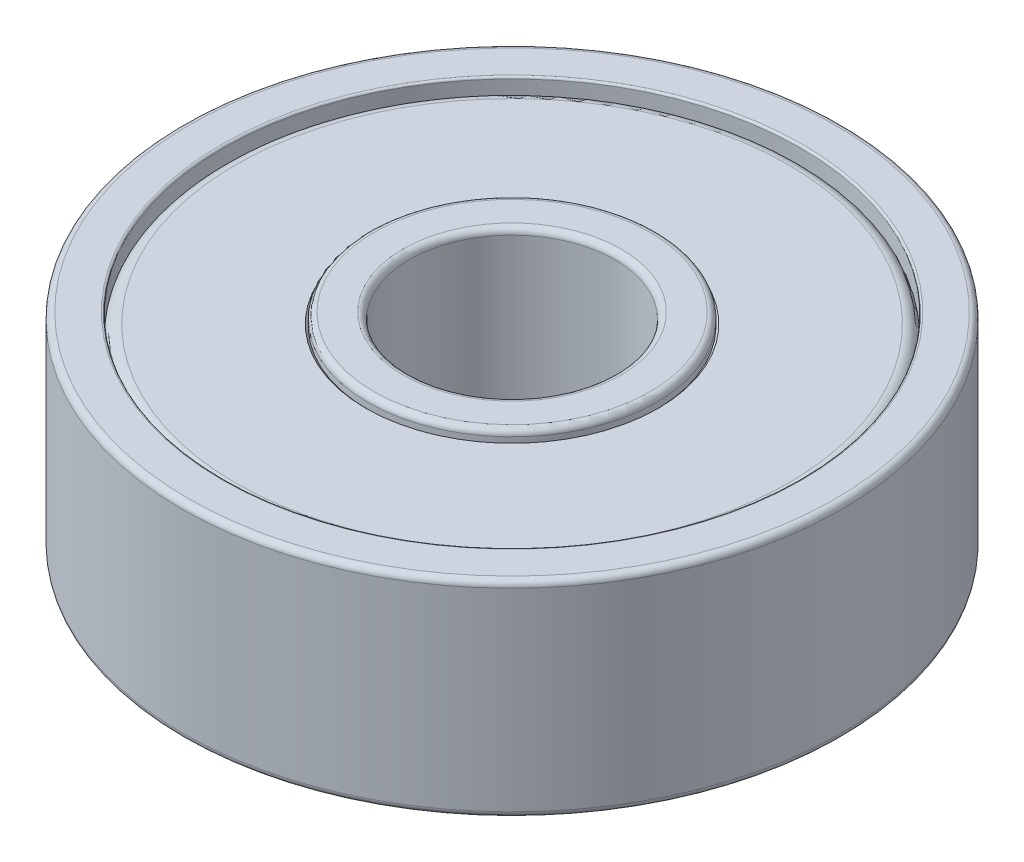
ISO-10303-21;
HEADER;
FILE_DESCRIPTION(('STEP AP214'),'2;1');
FILE_NAME('part.step','',(''),(''),'','','');
FILE_SCHEMA(('AUTOMOTIVE_DESIGN { 1 0 10303 214 1 1 1 1 }'));
ENDSEC;
DATA;
#1=APPLICATION_CONTEXT('core data for automotive mechanical design processes');
#2=APPLICATION_PROTOCOL_DEFINITION('international standard','automotive_design',2000,#1);
#3=PRODUCT_CONTEXT('',#1,'mechanical');
#4=PRODUCT('Part','Part','',(#3));
#5=PRODUCT_RELATED_PRODUCT_CATEGORY('part','',(#4));
#6=PRODUCT_DEFINITION_FORMATION('','',#4);
#7=PRODUCT_DEFINITION_CONTEXT('part definition',#1,'design');
#8=PRODUCT_DEFINITION('design','',#6,#7);
#9=PRODUCT_DEFINITION_SHAPE('','',#8);
#10=(LENGTH_UNIT() NAMED_UNIT(*) SI_UNIT(.MILLI.,.METRE.));
#11=(NAMED_UNIT(*) PLANE_ANGLE_UNIT() SI_UNIT($,.RADIAN.));
#12=(NAMED_UNIT(*) SI_UNIT($,.STERADIAN.) SOLID_ANGLE_UNIT());
#13=UNCERTAINTY_MEASURE_WITH_UNIT(LENGTH_MEASURE(1.E-05),#10,'distance_accuracy_value','');
#14=(GEOMETRIC_REPRESENTATION_CONTEXT(3) GLOBAL_UNCERTAINTY_ASSIGNED_CONTEXT((#13)) GLOBAL_UNIT_ASSIGNED_CONTEXT((#10,
#11,#12)) REPRESENTATION_CONTEXT('',''));
#15=CARTESIAN_POINT('',(0.,0.,0.));
#16=DIRECTION('',(0.,0.,1.));
#17=DIRECTION('',(1.,0.,0.));
#18=AXIS2_PLACEMENT_3D('',#15,#16,#17);
#19=CARTESIAN_POINT('',(0.,2.25,0.));
#20=DIRECTION('',(0.,1.,0.));
#21=DIRECTION('',(0.,0.,1.));
#22=AXIS2_PLACEMENT_3D('',#19,#20,#21);
#23=PLANE('',#22);
#24=CARTESIAN_POINT('',(0.,2.25,0.));
#25=DIRECTION('',(0.,1.,0.));
#26=DIRECTION('',(0.,0.,1.));
#27=AXIS2_PLACEMENT_3D('',#24,#25,#26);
#28=CIRCLE('',#27,3.55);
#29=CARTESIAN_POINT('',(0.,2.25,3.55));
#30=VERTEX_POINT('',#29);
#31=EDGE_CURVE('E12',#30,#30,#28,.F.);
#32=ORIENTED_EDGE('',*,*,#31,.T.);
#33=EDGE_LOOP('',(#32));
#34=FACE_BOUND('',#33,.T.);
#35=CARTESIAN_POINT('',(0.,2.25,0.));
#36=DIRECTION('',(0.,1.,0.));
#37=DIRECTION('',(0.,0.,1.));
#38=AXIS2_PLACEMENT_3D('',#35,#36,#37);
#39=CIRCLE('',#38,6.7);
#40=CARTESIAN_POINT('',(0.,2.25,6.7));
#41=VERTEX_POINT('',#40);
#42=EDGE_CURVE('E72',#41,#41,#39,.T.);
#43=ORIENTED_EDGE('',*,*,#42,.T.);
#44=EDGE_LOOP('',(#43));
#45=FACE_BOUND('',#44,.T.);
#46=ADVANCED_FACE('F52',(#34,#45),#23,.T.);
#47=CARTESIAN_POINT('',(0.,-2.25,0.));
#48=DIRECTION('',(0.,1.,0.));
#49=DIRECTION('',(0.,0.,1.));
#50=AXIS2_PLACEMENT_3D('',#47,#48,#49);
#51=PLANE('',#50);
#52=CARTESIAN_POINT('',(0.,-2.25,0.));
#53=DIRECTION('',(0.,1.,0.));
#54=DIRECTION('',(0.,0.,1.));
#55=AXIS2_PLACEMENT_3D('',#52,#53,#54);
#56=CIRCLE('',#55,3.55);
#57=CARTESIAN_POINT('',(0.,-2.25,3.55));
#58=VERTEX_POINT('',#57);
#59=EDGE_CURVE('E67',#58,#58,#56,.T.);
#60=ORIENTED_EDGE('',*,*,#59,.T.);
#61=EDGE_LOOP('',(#60));
#62=FACE_BOUND('',#61,.T.);
#63=CARTESIAN_POINT('',(0.,-2.25,0.));
#64=DIRECTION('',(0.,1.,0.));
#65=DIRECTION('',(0.,0.,1.));
#66=AXIS2_PLACEMENT_3D('',#63,#64,#65);
#67=CIRCLE('',#66,6.7);
#68=CARTESIAN_POINT('',(0.,-2.25,6.7));
#69=VERTEX_POINT('',#68);
#70=EDGE_CURVE('E75',#69,#69,#67,.F.);
#71=ORIENTED_EDGE('',*,*,#70,.T.);
#72=EDGE_LOOP('',(#71));
#73=FACE_BOUND('',#72,.T.);
#74=ADVANCED_FACE('F96',(#62,#73),#51,.F.);
#75=CARTESIAN_POINT('',(0.,2.25,0.));
#76=DIRECTION('',(0.,-1.,0.));
#77=DIRECTION('',(0.,0.,-1.));
#78=AXIS2_PLACEMENT_3D('',#75,#76,#77);
#79=CYLINDRICAL_SURFACE('',#78,7.);
#80=CARTESIAN_POINT('',(0.,-1.95,0.));
#81=DIRECTION('',(0.,1.,0.));
#82=DIRECTION('',(0.,0.,1.));
#83=AXIS2_PLACEMENT_3D('',#80,#81,#82);
#84=CIRCLE('',#83,7.);
#85=CARTESIAN_POINT('',(0.,-1.95,7.));
#86=VERTEX_POINT('',#85);
#87=EDGE_CURVE('E78',#86,#86,#84,.T.);
#88=ORIENTED_EDGE('',*,*,#87,.T.);
#89=EDGE_LOOP('',(#88));
#90=FACE_BOUND('',#89,.T.);
#91=CARTESIAN_POINT('',(0.,1.95,0.));
#92=DIRECTION('',(0.,1.,0.));
#93=DIRECTION('',(0.,0.,1.));
#94=AXIS2_PLACEMENT_3D('',#91,#92,#93);
#95=CIRCLE('',#94,7.);
#96=CARTESIAN_POINT('',(0.,1.95,7.));
#97=VERTEX_POINT('',#96);
#98=EDGE_CURVE('E81',#97,#97,#95,.F.);
#99=ORIENTED_EDGE('',*,*,#98,.T.);
#100=EDGE_LOOP('',(#99));
#101=FACE_BOUND('',#100,.T.);
#102=ADVANCED_FACE('F85',(#90,#101),#79,.T.);
#103=CARTESIAN_POINT('',(0.,2.25,0.));
#104=DIRECTION('',(0.,-1.,0.));
#105=DIRECTION('',(0.,0.,-1.));
#106=AXIS2_PLACEMENT_3D('',#103,#104,#105);
#107=CYLINDRICAL_SURFACE('',#106,3.5);
#108=CARTESIAN_POINT('',(0.,-2.2,0.));
#109=DIRECTION('',(0.,1.,0.));
#110=DIRECTION('',(0.,0.,1.));
#111=AXIS2_PLACEMENT_3D('',#108,#109,#110);
#112=CIRCLE('',#111,3.5);
#113=CARTESIAN_POINT('',(0.,-2.2,3.5));
#114=VERTEX_POINT('',#113);
#115=EDGE_CURVE('E59',#114,#114,#112,.F.);
#116=ORIENTED_EDGE('',*,*,#115,.T.);
#117=EDGE_LOOP('',(#116));
#118=FACE_BOUND('',#117,.T.);
#119=CARTESIAN_POINT('',(0.,2.2,0.));
#120=DIRECTION('',(0.,1.,0.));
#121=DIRECTION('',(0.,0.,1.));
#122=AXIS2_PLACEMENT_3D('',#119,#120,#121);
#123=CIRCLE('',#122,3.5);
#124=CARTESIAN_POINT('',(0.,2.2,3.5));
#125=VERTEX_POINT('',#124);
#126=EDGE_CURVE('E63',#125,#125,#123,.T.);
#127=ORIENTED_EDGE('',*,*,#126,.T.);
#128=EDGE_LOOP('',(#127));
#129=FACE_BOUND('',#128,.T.);
#130=ADVANCED_FACE('F104',(#118,#129),#107,.F.);
#131=CARTESIAN_POINT('',(0.,-1.95,0.));
#132=DIRECTION('',(0.,1.,0.));
#133=DIRECTION('',(0.,0.,1.));
#134=AXIS2_PLACEMENT_3D('',#131,#132,#133);
#135=TOROIDAL_SURFACE('',#134,6.7,0.3);
#136=ORIENTED_EDGE('',*,*,#70,.F.);
#137=EDGE_LOOP('',(#136));
#138=FACE_BOUND('',#137,.T.);
#139=ORIENTED_EDGE('',*,*,#87,.F.);
#140=EDGE_LOOP('',(#139));
#141=FACE_BOUND('',#140,.T.);
#142=ADVANCED_FACE('F91',(#138,#141),#135,.T.);
#143=CARTESIAN_POINT('',(0.,1.95,0.));
#144=DIRECTION('',(0.,1.,0.));
#145=DIRECTION('',(0.,0.,1.));
#146=AXIS2_PLACEMENT_3D('',#143,#144,#145);
#147=TOROIDAL_SURFACE('',#146,6.7,0.3);
#148=ORIENTED_EDGE('',*,*,#98,.F.);
#149=EDGE_LOOP('',(#148));
#150=FACE_BOUND('',#149,.T.);
#151=ORIENTED_EDGE('',*,*,#42,.F.);
#152=EDGE_LOOP('',(#151));
#153=FACE_BOUND('',#152,.T.);
#154=ADVANCED_FACE('F87',(#150,#153),#147,.T.);
#155=CARTESIAN_POINT('',(0.,-2.25,0.));
#156=DIRECTION('',(0.,-1.,0.));
#157=DIRECTION('',(0.,0.,-1.));
#158=AXIS2_PLACEMENT_3D('',#155,#156,#157);
#159=CONICAL_SURFACE('',#158,3.55,0.785398163397453);
#160=ORIENTED_EDGE('',*,*,#115,.F.);
#161=EDGE_LOOP('',(#160));
#162=FACE_BOUND('',#161,.T.);
#163=ORIENTED_EDGE('',*,*,#59,.F.);
#164=EDGE_LOOP('',(#163));
#165=FACE_BOUND('',#164,.T.);
#166=ADVANCED_FACE('F90',(#162,#165),#159,.F.);
#167=CARTESIAN_POINT('',(0.,2.2,0.));
#168=DIRECTION('',(0.,1.,0.));
#169=DIRECTION('',(0.,0.,1.));
#170=AXIS2_PLACEMENT_3D('',#167,#168,#169);
#171=CONICAL_SURFACE('',#170,3.5,0.785398163397483);
#172=CARTESIAN_POINT('',(0.,2.25,3.55));
#173=CARTESIAN_POINT('',(0.,2.24947916666667,3.54947916666667));
#174=CARTESIAN_POINT('',(0.,2.24895833333333,3.54895833333333));
#175=CARTESIAN_POINT('',(0.,2.24791666666667,3.54791666666667));
#176=CARTESIAN_POINT('',(0.,2.24739583333333,3.54739583333333));
#177=CARTESIAN_POINT('',(0.,2.24635416666667,3.54635416666667));
#178=CARTESIAN_POINT('',(0.,2.24583333333333,3.54583333333333));
#179=CARTESIAN_POINT('',(0.,2.24479166666667,3.54479166666667));
#180=CARTESIAN_POINT('',(0.,2.24427083333333,3.54427083333333));
#181=CARTESIAN_POINT('',(0.,2.24322916666667,3.54322916666667));
#182=CARTESIAN_POINT('',(0.,2.24270833333333,3.54270833333333));
#183=CARTESIAN_POINT('',(0.,2.24166666666667,3.54166666666667));
#184=CARTESIAN_POINT('',(0.,2.24114583333333,3.54114583333333));
#185=CARTESIAN_POINT('',(0.,2.24010416666667,3.54010416666667));
#186=CARTESIAN_POINT('',(0.,2.23958333333333,3.53958333333333));
#187=CARTESIAN_POINT('',(0.,2.23854166666667,3.53854166666667));
#188=CARTESIAN_POINT('',(0.,2.23802083333333,3.53802083333333));
#189=CARTESIAN_POINT('',(0.,2.23697916666667,3.53697916666667));
#190=CARTESIAN_POINT('',(0.,2.23645833333333,3.53645833333333));
#191=CARTESIAN_POINT('',(0.,2.23541666666667,3.53541666666667));
#192=CARTESIAN_POINT('',(0.,2.23489583333333,3.53489583333333));
#193=CARTESIAN_POINT('',(0.,2.23385416666667,3.53385416666667));
#194=CARTESIAN_POINT('',(0.,2.23333333333333,3.53333333333333));
#195=CARTESIAN_POINT('',(0.,2.23229166666667,3.53229166666667));
#196=CARTESIAN_POINT('',(0.,2.23177083333333,3.53177083333333));
#197=CARTESIAN_POINT('',(0.,2.23072916666667,3.53072916666667));
#198=CARTESIAN_POINT('',(0.,2.23020833333333,3.53020833333333));
#199=CARTESIAN_POINT('',(0.,2.22916666666667,3.52916666666667));
#200=CARTESIAN_POINT('',(0.,2.22864583333333,3.52864583333333));
#201=CARTESIAN_POINT('',(0.,2.22760416666667,3.52760416666667));
#202=CARTESIAN_POINT('',(0.,2.22708333333333,3.52708333333333));
#203=CARTESIAN_POINT('',(0.,2.22604166666667,3.52604166666667));
#204=CARTESIAN_POINT('',(0.,2.22552083333334,3.52552083333333));
#205=CARTESIAN_POINT('',(0.,2.22447916666667,3.52447916666667));
#206=CARTESIAN_POINT('',(0.,2.22395833333334,3.52395833333333));
#207=CARTESIAN_POINT('',(0.,2.22291666666667,3.52291666666667));
#208=CARTESIAN_POINT('',(0.,2.22239583333334,3.52239583333333));
#209=CARTESIAN_POINT('',(0.,2.22135416666667,3.52135416666667));
#210=CARTESIAN_POINT('',(0.,2.22083333333334,3.52083333333333));
#211=CARTESIAN_POINT('',(0.,2.21979166666667,3.51979166666667));
#212=CARTESIAN_POINT('',(0.,2.21927083333334,3.51927083333333));
#213=CARTESIAN_POINT('',(0.,2.21822916666667,3.51822916666667));
#214=CARTESIAN_POINT('',(0.,2.21770833333334,3.51770833333333));
#215=CARTESIAN_POINT('',(0.,2.21666666666667,3.51666666666667));
#216=CARTESIAN_POINT('',(0.,2.21614583333334,3.51614583333333));
#217=CARTESIAN_POINT('',(0.,2.21510416666667,3.51510416666667));
#218=CARTESIAN_POINT('',(0.,2.21458333333334,3.51458333333333));
#219=CARTESIAN_POINT('',(0.,2.21354166666667,3.51354166666667));
#220=CARTESIAN_POINT('',(0.,2.21302083333334,3.51302083333333));
#221=CARTESIAN_POINT('',(0.,2.21197916666667,3.51197916666667));
#222=CARTESIAN_POINT('',(0.,2.21145833333334,3.51145833333333));
#223=CARTESIAN_POINT('',(0.,2.21041666666667,3.51041666666667));
#224=CARTESIAN_POINT('',(0.,2.20989583333334,3.50989583333333));
#225=CARTESIAN_POINT('',(0.,2.20885416666667,3.50885416666667));
#226=CARTESIAN_POINT('',(0.,2.20833333333334,3.50833333333333));
#227=CARTESIAN_POINT('',(0.,2.20729166666667,3.50729166666667));
#228=CARTESIAN_POINT('',(0.,2.20677083333334,3.50677083333333));
#229=CARTESIAN_POINT('',(0.,2.20572916666667,3.50572916666667));
#230=CARTESIAN_POINT('',(0.,2.20520833333334,3.50520833333333));
#231=CARTESIAN_POINT('',(0.,2.20416666666667,3.50416666666667));
#232=CARTESIAN_POINT('',(0.,2.20364583333334,3.50364583333333));
#233=CARTESIAN_POINT('',(0.,2.20260416666667,3.50260416666667));
#234=CARTESIAN_POINT('',(0.,2.20208333333334,3.50208333333333));
#235=CARTESIAN_POINT('',(0.,2.20104166666667,3.50104166666667));
#236=CARTESIAN_POINT('',(0.,2.20052083333334,3.50052083333333));
#237=CARTESIAN_POINT('',(0.,2.2,3.5));
#238=B_SPLINE_CURVE_WITH_KNOTS('',3,(#172,#173,#174,#175,#176,#177,#178,#179,#180,#181,#182,
#183,#184,#185,#186,#187,#188,#189,#190,#191,#192,#193,#194,#195,#196,#197,#198,#199,#200,#201,
#202,#203,#204,#205,#206,#207,#208,#209,#210,#211,#212,#213,#214,#215,#216,#217,#218,#219,#220,
#221,#222,#223,#224,#225,#226,#227,#228,#229,#230,#231,#232,#233,#234,#235,#236,#237),
.UNSPECIFIED.,.F.,.F.,(4,2,2,2,2,2,2,2,2,2,2,2,2,2,2,2,2,2,2,2,2,2,2,2,2,2,2,2,2,2,2,2,4),(0.,
0.00220970869120833,0.00441941738241605,0.00662912607362377,0.00883883476483179,
0.0110485434560395,0.0132582521472475,0.0154679608384553,0.017677669529663,0.019887378220871,
0.0220970869120787,0.0243067956032867,0.0265165042944948,0.0287262129857025,0.0309359216769102,
0.0331456303681182,0.0353553390593259,0.0375650477505337,0.0397747564417417,0.0419844651329494,
0.0441941738241571,0.0464038825153652,0.0486135912065732,0.0508232998977809,0.0530330085889889,
0.0552427172801966,0.0574524259714044,0.0596621346626124,0.0618718433538201,0.0640815520450278,
0.0662912607362358,0.0685009694274436,0.0707106781186516),.UNSPECIFIED.);
#239=EDGE_CURVE('BSEAM54',#30,#125,#238,.T.);
#240=ORIENTED_EDGE('',*,*,#31,.F.);
#241=ORIENTED_EDGE('',*,*,#126,.F.);
#242=ORIENTED_EDGE('',*,*,#239,.T.);
#243=ORIENTED_EDGE('',*,*,#239,.F.);
#244=EDGE_LOOP('',(#240,#242,#241,#243));
#245=FACE_BOUND('',#244,.T.);
#246=ADVANCED_FACE('F54',(#245),#171,.F.);
#247=CLOSED_SHELL('',(#46,#74,#102,#130,#142,#154,#166,#246));
#248=MANIFOLD_SOLID_BREP('B2',#247);
#249=CARTESIAN_POINT('',(0.,2.5,0.));
#250=DIRECTION('',(0.,-1.,0.));
#251=DIRECTION('',(0.,0.,-1.));
#252=AXIS2_PLACEMENT_3D('',#249,#250,#251);
#253=CYLINDRICAL_SURFACE('',#252,2.5);
#254=CARTESIAN_POINT('',(0.,-2.35,0.));
#255=DIRECTION('',(0.,1.,0.));
#256=DIRECTION('',(0.,0.,1.));
#257=AXIS2_PLACEMENT_3D('',#254,#255,#256);
#258=CIRCLE('',#257,2.5);
#259=CARTESIAN_POINT('',(0.,-2.35,2.5));
#260=VERTEX_POINT('',#259);
#261=EDGE_CURVE('E201',#260,#260,#258,.F.);
#262=ORIENTED_EDGE('',*,*,#261,.T.);
#263=EDGE_LOOP('',(#262));
#264=FACE_BOUND('',#263,.T.);
#265=CARTESIAN_POINT('',(0.,2.35,0.));
#266=DIRECTION('',(0.,1.,0.));
#267=DIRECTION('',(0.,0.,1.));
#268=AXIS2_PLACEMENT_3D('',#265,#266,#267);
#269=CIRCLE('',#268,2.5);
#270=CARTESIAN_POINT('',(0.,2.35,2.5));
#271=VERTEX_POINT('',#270);
#272=EDGE_CURVE('E204',#271,#271,#269,.T.);
#273=ORIENTED_EDGE('',*,*,#272,.T.);
#274=EDGE_LOOP('',(#273));
#275=FACE_BOUND('',#274,.T.);
#276=ADVANCED_FACE('F181',(#264,#275),#253,.F.);
#277=CARTESIAN_POINT('',(0.,2.5,0.));
#278=DIRECTION('',(0.,-1.,0.));
#279=DIRECTION('',(0.,0.,-1.));
#280=AXIS2_PLACEMENT_3D('',#277,#278,#279);
#281=CYLINDRICAL_SURFACE('',#280,3.5);
#282=CARTESIAN_POINT('',(0.,-2.35,0.));
#283=DIRECTION('',(0.,1.,0.));
#284=DIRECTION('',(0.,0.,1.));
#285=AXIS2_PLACEMENT_3D('',#282,#283,#284);
#286=CIRCLE('',#285,3.5);
#287=CARTESIAN_POINT('',(0.,-2.35,3.5));
#288=VERTEX_POINT('',#287);
#289=EDGE_CURVE('E51',#288,#288,#286,.T.);
#290=ORIENTED_EDGE('',*,*,#289,.T.);
#291=EDGE_LOOP('',(#290));
#292=FACE_BOUND('',#291,.T.);
#293=CARTESIAN_POINT('',(0.,2.35,0.));
#294=DIRECTION('',(0.,1.,0.));
#295=DIRECTION('',(0.,0.,1.));
#296=AXIS2_PLACEMENT_3D('',#293,#294,#295);
#297=CIRCLE('',#296,3.5);
#298=CARTESIAN_POINT('',(0.,2.35,3.5));
#299=VERTEX_POINT('',#298);
#300=EDGE_CURVE('E188',#299,#299,#297,.F.);
#301=ORIENTED_EDGE('',*,*,#300,.T.);
#302=EDGE_LOOP('',(#301));
#303=FACE_BOUND('',#302,.T.);
#304=ADVANCED_FACE('F229',(#292,#303),#281,.T.);
#305=CARTESIAN_POINT('',(0.,2.5,0.));
#306=DIRECTION('',(0.,1.,0.));
#307=DIRECTION('',(0.,0.,1.));
#308=AXIS2_PLACEMENT_3D('',#305,#306,#307);
#309=PLANE('',#308);
#310=CARTESIAN_POINT('',(0.,2.5,0.));
#311=DIRECTION('',(0.,1.,0.));
#312=DIRECTION('',(0.,0.,1.));
#313=AXIS2_PLACEMENT_3D('',#310,#311,#312);
#314=CIRCLE('',#313,2.65);
#315=CARTESIAN_POINT('',(0.,2.5,2.65));
#316=VERTEX_POINT('',#315);
#317=EDGE_CURVE('E192',#316,#316,#314,.F.);
#318=ORIENTED_EDGE('',*,*,#317,.T.);
#319=EDGE_LOOP('',(#318));
#320=FACE_BOUND('',#319,.T.);
#321=CARTESIAN_POINT('',(0.,2.5,0.));
#322=DIRECTION('',(0.,1.,0.));
#323=DIRECTION('',(0.,0.,1.));
#324=AXIS2_PLACEMENT_3D('',#321,#322,#323);
#325=CIRCLE('',#324,3.35);
#326=CARTESIAN_POINT('',(0.,2.5,3.35));
#327=VERTEX_POINT('',#326);
#328=EDGE_CURVE('E196',#327,#327,#325,.T.);
#329=ORIENTED_EDGE('',*,*,#328,.T.);
#330=EDGE_LOOP('',(#329));
#331=FACE_BOUND('',#330,.T.);
#332=ADVANCED_FACE('F235',(#320,#331),#309,.T.);
#333=CARTESIAN_POINT('',(0.,-2.5,0.));
#334=DIRECTION('',(0.,1.,0.));
#335=DIRECTION('',(0.,0.,1.));
#336=AXIS2_PLACEMENT_3D('',#333,#334,#335);
#337=PLANE('',#336);
#338=CARTESIAN_POINT('',(0.,-2.5,0.));
#339=DIRECTION('',(0.,1.,0.));
#340=DIRECTION('',(0.,0.,1.));
#341=AXIS2_PLACEMENT_3D('',#338,#339,#340);
#342=CIRCLE('',#341,2.65);
#343=CARTESIAN_POINT('',(0.,-2.5,2.65));
#344=VERTEX_POINT('',#343);
#345=EDGE_CURVE('E207',#344,#344,#342,.T.);
#346=ORIENTED_EDGE('',*,*,#345,.T.);
#347=EDGE_LOOP('',(#346));
#348=FACE_BOUND('',#347,.T.);
#349=CARTESIAN_POINT('',(0.,-2.5,0.));
#350=DIRECTION('',(0.,1.,0.));
#351=DIRECTION('',(0.,0.,1.));
#352=AXIS2_PLACEMENT_3D('',#349,#350,#351);
#353=CIRCLE('',#352,3.35);
#354=CARTESIAN_POINT('',(0.,-2.5,3.35));
#355=VERTEX_POINT('',#354);
#356=EDGE_CURVE('E210',#355,#355,#353,.F.);
#357=ORIENTED_EDGE('',*,*,#356,.T.);
#358=EDGE_LOOP('',(#357));
#359=FACE_BOUND('',#358,.T.);
#360=ADVANCED_FACE('F214',(#348,#359),#337,.F.);
#361=CARTESIAN_POINT('',(0.,-2.35,0.));
#362=DIRECTION('',(0.,1.,0.));
#363=DIRECTION('',(0.,0.,1.));
#364=AXIS2_PLACEMENT_3D('',#361,#362,#363);
#365=TOROIDAL_SURFACE('',#364,2.65,0.15);
#366=ORIENTED_EDGE('',*,*,#261,.F.);
#367=EDGE_LOOP('',(#366));
#368=FACE_BOUND('',#367,.T.);
#369=ORIENTED_EDGE('',*,*,#345,.F.);
#370=EDGE_LOOP('',(#369));
#371=FACE_BOUND('',#370,.T.);
#372=ADVANCED_FACE('F225',(#368,#371),#365,.T.);
#373=CARTESIAN_POINT('',(0.,2.35,0.));
#374=DIRECTION('',(0.,1.,0.));
#375=DIRECTION('',(0.,0.,1.));
#376=AXIS2_PLACEMENT_3D('',#373,#374,#375);
#377=TOROIDAL_SURFACE('',#376,2.65,0.15);
#378=ORIENTED_EDGE('',*,*,#317,.F.);
#379=EDGE_LOOP('',(#378));
#380=FACE_BOUND('',#379,.T.);
#381=ORIENTED_EDGE('',*,*,#272,.F.);
#382=EDGE_LOOP('',(#381));
#383=FACE_BOUND('',#382,.T.);
#384=ADVANCED_FACE('F219',(#380,#383),#377,.T.);
#385=CARTESIAN_POINT('',(0.,-2.35,0.));
#386=DIRECTION('',(0.,1.,0.));
#387=DIRECTION('',(0.,0.,1.));
#388=AXIS2_PLACEMENT_3D('',#385,#386,#387);
#389=TOROIDAL_SURFACE('',#388,3.35,0.15);
#390=ORIENTED_EDGE('',*,*,#356,.F.);
#391=EDGE_LOOP('',(#390));
#392=FACE_BOUND('',#391,.T.);
#393=ORIENTED_EDGE('',*,*,#289,.F.);
#394=EDGE_LOOP('',(#393));
#395=FACE_BOUND('',#394,.T.);
#396=ADVANCED_FACE('F216',(#392,#395),#389,.T.);
#397=CARTESIAN_POINT('',(0.,2.35,0.));
#398=DIRECTION('',(0.,1.,0.));
#399=DIRECTION('',(0.,0.,1.));
#400=AXIS2_PLACEMENT_3D('',#397,#398,#399);
#401=TOROIDAL_SURFACE('',#400,3.35,0.15);
#402=ORIENTED_EDGE('',*,*,#300,.F.);
#403=EDGE_LOOP('',(#402));
#404=FACE_BOUND('',#403,.T.);
#405=ORIENTED_EDGE('',*,*,#328,.F.);
#406=EDGE_LOOP('',(#405));
#407=FACE_BOUND('',#406,.T.);
#408=ADVANCED_FACE('F183',(#404,#407),#401,.T.);
#409=CLOSED_SHELL('',(#276,#304,#332,#360,#372,#384,#396,#408));
#410=MANIFOLD_SOLID_BREP('B7',#409);
#411=CARTESIAN_POINT('',(0.,2.5,0.));
#412=DIRECTION('',(0.,-1.,0.));
#413=DIRECTION('',(0.,0.,-1.));
#414=AXIS2_PLACEMENT_3D('',#411,#412,#413);
#415=CYLINDRICAL_SURFACE('',#414,7.);
#416=CARTESIAN_POINT('',(0.,-2.45,0.));
#417=DIRECTION('',(0.,1.,0.));
#418=DIRECTION('',(0.,0.,1.));
#419=AXIS2_PLACEMENT_3D('',#416,#417,#418);
#420=CIRCLE('',#419,7.);
#421=CARTESIAN_POINT('',(0.,-2.45,7.));
#422=VERTEX_POINT('',#421);
#423=EDGE_CURVE('E310',#422,#422,#420,.F.);
#424=ORIENTED_EDGE('',*,*,#423,.T.);
#425=EDGE_LOOP('',(#424));
#426=FACE_BOUND('',#425,.T.);
#427=CARTESIAN_POINT('',(0.,2.45,0.));
#428=DIRECTION('',(0.,1.,0.));
#429=DIRECTION('',(0.,0.,1.));
#430=AXIS2_PLACEMENT_3D('',#427,#428,#429);
#431=CIRCLE('',#430,7.);
#432=CARTESIAN_POINT('',(0.,2.45,7.));
#433=VERTEX_POINT('',#432);
#434=EDGE_CURVE('E314',#433,#433,#431,.T.);
#435=ORIENTED_EDGE('',*,*,#434,.T.);
#436=EDGE_LOOP('',(#435));
#437=FACE_BOUND('',#436,.T.);
#438=ADVANCED_FACE('F303',(#426,#437),#415,.F.);
#439=CARTESIAN_POINT('',(0.,2.5,0.));
#440=DIRECTION('',(0.,-1.,0.));
#441=DIRECTION('',(0.,0.,-1.));
#442=AXIS2_PLACEMENT_3D('',#439,#440,#441);
#443=CYLINDRICAL_SURFACE('',#442,8.);
#444=CARTESIAN_POINT('',(0.,-2.35,0.));
#445=DIRECTION('',(0.,1.,0.));
#446=DIRECTION('',(0.,0.,1.));
#447=AXIS2_PLACEMENT_3D('',#444,#445,#446);
#448=CIRCLE('',#447,8.);
#449=CARTESIAN_POINT('',(0.,-2.35,8.));
#450=VERTEX_POINT('',#449);
#451=EDGE_CURVE('E329',#450,#450,#448,.T.);
#452=ORIENTED_EDGE('',*,*,#451,.T.);
#453=EDGE_LOOP('',(#452));
#454=FACE_BOUND('',#453,.T.);
#455=CARTESIAN_POINT('',(0.,2.35,0.));
#456=DIRECTION('',(0.,1.,0.));
#457=DIRECTION('',(0.,0.,1.));
#458=AXIS2_PLACEMENT_3D('',#455,#456,#457);
#459=CIRCLE('',#458,8.);
#460=CARTESIAN_POINT('',(0.,2.35,8.));
#461=VERTEX_POINT('',#460);
#462=EDGE_CURVE('E332',#461,#461,#459,.F.);
#463=ORIENTED_EDGE('',*,*,#462,.T.);
#464=EDGE_LOOP('',(#463));
#465=FACE_BOUND('',#464,.T.);
#466=ADVANCED_FACE('F336',(#454,#465),#443,.T.);
#467=CARTESIAN_POINT('',(0.,2.5,0.));
#468=DIRECTION('',(0.,1.,0.));
#469=DIRECTION('',(0.,0.,1.));
#470=AXIS2_PLACEMENT_3D('',#467,#468,#469);
#471=PLANE('',#470);
#472=CARTESIAN_POINT('',(0.,2.5,0.));
#473=DIRECTION('',(0.,1.,0.));
#474=DIRECTION('',(0.,0.,1.));
#475=AXIS2_PLACEMENT_3D('',#472,#473,#474);
#476=CIRCLE('',#475,7.05);
#477=CARTESIAN_POINT('',(0.,2.5,7.05));
#478=VERTEX_POINT('',#477);
#479=EDGE_CURVE('E180',#478,#478,#476,.F.);
#480=ORIENTED_EDGE('',*,*,#479,.T.);
#481=EDGE_LOOP('',(#480));
#482=FACE_BOUND('',#481,.T.);
#483=CARTESIAN_POINT('',(0.,2.5,0.));
#484=DIRECTION('',(0.,1.,0.));
#485=DIRECTION('',(0.,0.,1.));
#486=AXIS2_PLACEMENT_3D('',#483,#484,#485);
#487=CIRCLE('',#486,7.85);
#488=CARTESIAN_POINT('',(0.,2.5,7.85));
#489=VERTEX_POINT('',#488);
#490=EDGE_CURVE('E323',#489,#489,#487,.T.);
#491=ORIENTED_EDGE('',*,*,#490,.T.);
#492=EDGE_LOOP('',(#491));
#493=FACE_BOUND('',#492,.T.);
#494=ADVANCED_FACE('F346',(#482,#493),#471,.T.);
#495=CARTESIAN_POINT('',(0.,-2.5,0.));
#496=DIRECTION('',(0.,1.,0.));
#497=DIRECTION('',(0.,0.,1.));
#498=AXIS2_PLACEMENT_3D('',#495,#496,#497);
#499=PLANE('',#498);
#500=CARTESIAN_POINT('',(0.,-2.5,0.));
#501=DIRECTION('',(0.,1.,0.));
#502=DIRECTION('',(0.,0.,1.));
#503=AXIS2_PLACEMENT_3D('',#500,#501,#502);
#504=CIRCLE('',#503,7.05);
#505=CARTESIAN_POINT('',(0.,-2.5,7.05));
#506=VERTEX_POINT('',#505);
#507=EDGE_CURVE('E318',#506,#506,#504,.T.);
#508=ORIENTED_EDGE('',*,*,#507,.T.);
#509=EDGE_LOOP('',(#508));
#510=FACE_BOUND('',#509,.T.);
#511=CARTESIAN_POINT('',(0.,-2.5,0.));
#512=DIRECTION('',(0.,1.,0.));
#513=DIRECTION('',(0.,0.,1.));
#514=AXIS2_PLACEMENT_3D('',#511,#512,#513);
#515=CIRCLE('',#514,7.85);
#516=CARTESIAN_POINT('',(0.,-2.5,7.85));
#517=VERTEX_POINT('',#516);
#518=EDGE_CURVE('E326',#517,#517,#515,.F.);
#519=ORIENTED_EDGE('',*,*,#518,.T.);
#520=EDGE_LOOP('',(#519));
#521=FACE_BOUND('',#520,.T.);
#522=ADVANCED_FACE('F348',(#510,#521),#499,.F.);
#523=CARTESIAN_POINT('',(0.,-2.35,0.));
#524=DIRECTION('',(0.,1.,0.));
#525=DIRECTION('',(0.,0.,1.));
#526=AXIS2_PLACEMENT_3D('',#523,#524,#525);
#527=TOROIDAL_SURFACE('',#526,7.85,0.15);
#528=ORIENTED_EDGE('',*,*,#518,.F.);
#529=EDGE_LOOP('',(#528));
#530=FACE_BOUND('',#529,.T.);
#531=ORIENTED_EDGE('',*,*,#451,.F.);
#532=EDGE_LOOP('',(#531));
#533=FACE_BOUND('',#532,.T.);
#534=ADVANCED_FACE('F342',(#530,#533),#527,.T.);
#535=CARTESIAN_POINT('',(0.,2.35,0.));
#536=DIRECTION('',(0.,1.,0.));
#537=DIRECTION('',(0.,0.,1.));
#538=AXIS2_PLACEMENT_3D('',#535,#536,#537);
#539=TOROIDAL_SURFACE('',#538,7.85,0.15);
#540=ORIENTED_EDGE('',*,*,#462,.F.);
#541=EDGE_LOOP('',(#540));
#542=FACE_BOUND('',#541,.T.);
#543=ORIENTED_EDGE('',*,*,#490,.F.);
#544=EDGE_LOOP('',(#543));
#545=FACE_BOUND('',#544,.T.);
#546=ADVANCED_FACE('F338',(#542,#545),#539,.T.);
#547=CARTESIAN_POINT('',(0.,-2.45,0.));
#548=DIRECTION('',(0.,1.,0.));
#549=DIRECTION('',(0.,0.,1.));
#550=AXIS2_PLACEMENT_3D('',#547,#548,#549);
#551=TOROIDAL_SURFACE('',#550,7.05,0.05);
#552=ORIENTED_EDGE('',*,*,#423,.F.);
#553=EDGE_LOOP('',(#552));
#554=FACE_BOUND('',#553,.T.);
#555=ORIENTED_EDGE('',*,*,#507,.F.);
#556=EDGE_LOOP('',(#555));
#557=FACE_BOUND('',#556,.T.);
#558=ADVANCED_FACE('F341',(#554,#557),#551,.T.);
#559=CARTESIAN_POINT('',(0.,2.45,0.));
#560=DIRECTION('',(0.,1.,0.));
#561=DIRECTION('',(0.,0.,1.));
#562=AXIS2_PLACEMENT_3D('',#559,#560,#561);
#563=TOROIDAL_SURFACE('',#562,7.05,0.05);
#564=ORIENTED_EDGE('',*,*,#479,.F.);
#565=EDGE_LOOP('',(#564));
#566=FACE_BOUND('',#565,.T.);
#567=ORIENTED_EDGE('',*,*,#434,.F.);
#568=EDGE_LOOP('',(#567));
#569=FACE_BOUND('',#568,.T.);
#570=ADVANCED_FACE('F305',(#566,#569),#563,.T.);
#571=CLOSED_SHELL('',(#438,#466,#494,#522,#534,#546,#558,#570));
#572=MANIFOLD_SOLID_BREP('B46',#571);
#573=ADVANCED_BREP_SHAPE_REPRESENTATION('',(#18,#248,#410,#572),#14);
#574=SHAPE_DEFINITION_REPRESENTATION(#9,#573);
ENDSEC;
END-ISO-10303-21;
